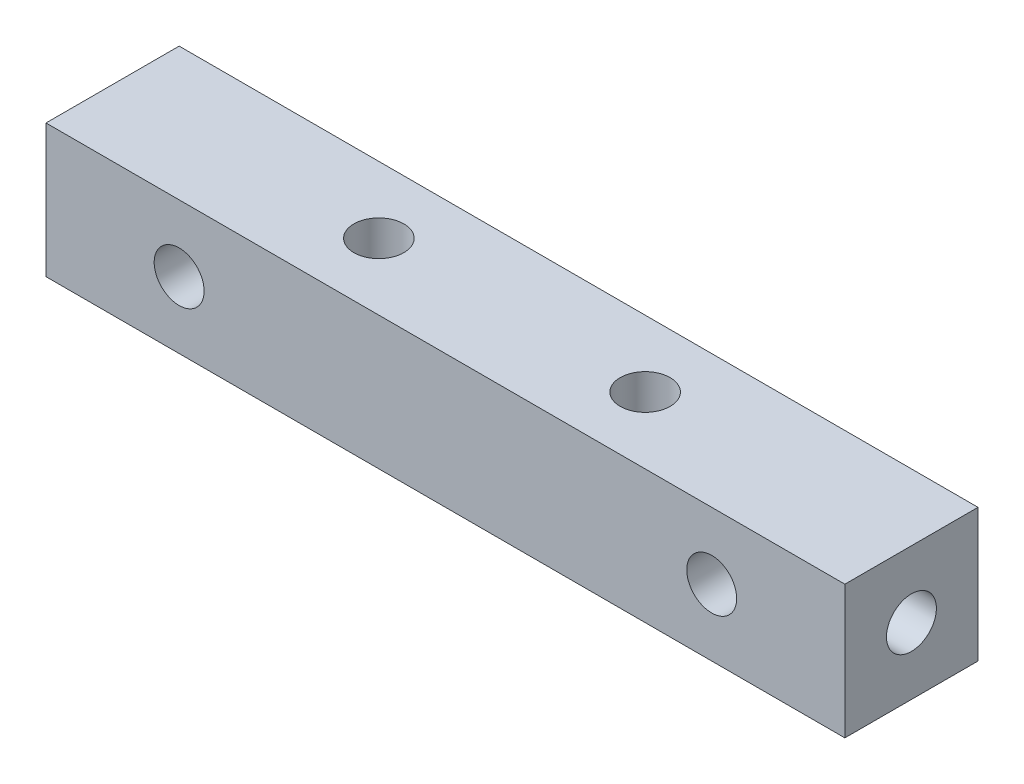
ISO-10303-21;
HEADER;
FILE_DESCRIPTION(('STEP AP214'),'2;1');
FILE_NAME('part.step','',(''),(''),'','','');
FILE_SCHEMA(('AUTOMOTIVE_DESIGN { 1 0 10303 214 1 1 1 1 }'));
ENDSEC;
DATA;
#1=APPLICATION_CONTEXT('core data for automotive mechanical design processes');
#2=APPLICATION_PROTOCOL_DEFINITION('international standard','automotive_design',2000,#1);
#3=PRODUCT_CONTEXT('',#1,'mechanical');
#4=PRODUCT('Part','Part','',(#3));
#5=PRODUCT_RELATED_PRODUCT_CATEGORY('part','',(#4));
#6=PRODUCT_DEFINITION_FORMATION('','',#4);
#7=PRODUCT_DEFINITION_CONTEXT('part definition',#1,'design');
#8=PRODUCT_DEFINITION('design','',#6,#7);
#9=PRODUCT_DEFINITION_SHAPE('','',#8);
#10=(LENGTH_UNIT() NAMED_UNIT(*) SI_UNIT(.MILLI.,.METRE.));
#11=(NAMED_UNIT(*) PLANE_ANGLE_UNIT() SI_UNIT($,.RADIAN.));
#12=(NAMED_UNIT(*) SI_UNIT($,.STERADIAN.) SOLID_ANGLE_UNIT());
#13=UNCERTAINTY_MEASURE_WITH_UNIT(LENGTH_MEASURE(1.E-05),#10,'distance_accuracy_value','');
#14=(GEOMETRIC_REPRESENTATION_CONTEXT(3) GLOBAL_UNCERTAINTY_ASSIGNED_CONTEXT((#13)) GLOBAL_UNIT_ASSIGNED_CONTEXT((#10,
#11,#12)) REPRESENTATION_CONTEXT('',''));
#15=CARTESIAN_POINT('',(0.,0.,0.));
#16=DIRECTION('',(0.,0.,1.));
#17=DIRECTION('',(1.,0.,0.));
#18=AXIS2_PLACEMENT_3D('',#15,#16,#17);
#19=CARTESIAN_POINT('',(16.,4.,-6.));
#20=DIRECTION('',(0.,0.,1.));
#21=DIRECTION('',(1.,0.,0.));
#22=AXIS2_PLACEMENT_3D('',#19,#20,#21);
#23=CYLINDRICAL_SURFACE('',#22,1.5);
#24=CARTESIAN_POINT('',(16.,4.,-4.));
#25=DIRECTION('',(0.,0.,1.));
#26=DIRECTION('',(1.,0.,0.));
#27=AXIS2_PLACEMENT_3D('',#24,#25,#26);
#28=CIRCLE('',#27,1.5);
#29=CARTESIAN_POINT('',(17.5,4.,-4.));
#30=VERTEX_POINT('',#29);
#31=EDGE_CURVE('E126',#30,#30,#28,.T.);
#32=ORIENTED_EDGE('',*,*,#31,.F.);
#33=EDGE_LOOP('',(#32));
#34=FACE_BOUND('',#33,.T.);
#35=CARTESIAN_POINT('',(16.,4.,4.));
#36=DIRECTION('',(0.,0.,1.));
#37=DIRECTION('',(1.,0.,0.));
#38=AXIS2_PLACEMENT_3D('',#35,#36,#37);
#39=CIRCLE('',#38,1.5);
#40=CARTESIAN_POINT('',(17.5,4.,4.));
#41=VERTEX_POINT('',#40);
#42=EDGE_CURVE('E175',#41,#41,#39,.T.);
#43=ORIENTED_EDGE('',*,*,#42,.T.);
#44=EDGE_LOOP('',(#43));
#45=FACE_BOUND('',#44,.T.);
#46=CARTESIAN_POINT('',(16.,4.,0.));
#47=DIRECTION('',(0.707106781186548,0.,0.707106781186547));
#48=DIRECTION('',(-0.707106781186547,0.,0.707106781186548));
#49=AXIS2_PLACEMENT_3D('',#46,#47,#48);
#50=ELLIPSE('',#49,2.12132034355964,1.5);
#51=CARTESIAN_POINT('',(16.,5.50000000000001,0.));
#52=VERTEX_POINT('',#51);
#53=CARTESIAN_POINT('',(16.,2.5,0.));
#54=VERTEX_POINT('',#53);
#55=EDGE_CURVE('E11',#52,#54,#50,.F.);
#56=ORIENTED_EDGE('',*,*,#55,.F.);
#57=CARTESIAN_POINT('',(16.,4.,0.));
#58=DIRECTION('',(-0.707106781186547,0.,0.707106781186548));
#59=DIRECTION('',(0.707106781186548,0.,0.707106781186547));
#60=AXIS2_PLACEMENT_3D('',#57,#58,#59);
#61=ELLIPSE('',#60,2.12132034355964,1.5);
#62=EDGE_CURVE('E50',#54,#52,#61,.T.);
#63=ORIENTED_EDGE('',*,*,#62,.F.);
#64=EDGE_LOOP('',(#56,#63));
#65=FACE_BOUND('',#64,.T.);
#66=ADVANCED_FACE('F39',(#34,#45,#65),#23,.F.);
#67=CARTESIAN_POINT('',(24.,8.,-4.));
#68=DIRECTION('',(-1.,0.,0.));
#69=DIRECTION('',(0.,0.,1.));
#70=AXIS2_PLACEMENT_3D('',#67,#68,#69);
#71=PLANE('',#70);
#72=CARTESIAN_POINT('',(24.,4.,0.));
#73=DIRECTION('',(-1.,0.,0.));
#74=DIRECTION('',(0.,0.,1.));
#75=AXIS2_PLACEMENT_3D('',#72,#73,#74);
#76=CIRCLE('',#75,1.5);
#77=CARTESIAN_POINT('',(24.,4.,1.5));
#78=VERTEX_POINT('',#77);
#79=EDGE_CURVE('E207',#78,#78,#76,.T.);
#80=ORIENTED_EDGE('',*,*,#79,.T.);
#81=EDGE_LOOP('',(#80));
#82=FACE_BOUND('',#81,.T.);
#83=DIRECTION('',(0.,0.,-1.));
#84=VECTOR('',#83,1.);
#85=CARTESIAN_POINT('',(24.,0.,-4.));
#86=LINE('',#85,#84);
#87=CARTESIAN_POINT('',(24.,0.,4.));
#88=VERTEX_POINT('',#87);
#89=CARTESIAN_POINT('',(24.,0.,-4.));
#90=VERTEX_POINT('',#89);
#91=EDGE_CURVE('E141',#88,#90,#86,.T.);
#92=ORIENTED_EDGE('',*,*,#91,.T.);
#93=DIRECTION('',(0.,-1.,0.));
#94=VECTOR('',#93,1.);
#95=CARTESIAN_POINT('',(24.,8.,-4.));
#96=LINE('',#95,#94);
#97=CARTESIAN_POINT('',(24.,8.,-4.));
#98=VERTEX_POINT('',#97);
#99=EDGE_CURVE('E137',#98,#90,#96,.T.);
#100=ORIENTED_EDGE('',*,*,#99,.F.);
#101=DIRECTION('',(0.,0.,-1.));
#102=VECTOR('',#101,1.);
#103=CARTESIAN_POINT('',(24.,8.,-4.));
#104=LINE('',#103,#102);
#105=CARTESIAN_POINT('',(24.,8.,4.));
#106=VERTEX_POINT('',#105);
#107=EDGE_CURVE('E153',#106,#98,#104,.T.);
#108=ORIENTED_EDGE('',*,*,#107,.F.);
#109=DIRECTION('',(0.,-1.,0.));
#110=VECTOR('',#109,1.);
#111=CARTESIAN_POINT('',(24.,8.,4.));
#112=LINE('',#111,#110);
#113=EDGE_CURVE('E159',#106,#88,#112,.T.);
#114=ORIENTED_EDGE('',*,*,#113,.T.);
#115=EDGE_LOOP('',(#92,#100,#108,#114));
#116=FACE_BOUND('',#115,.T.);
#117=ADVANCED_FACE('F41',(#82,#116),#71,.F.);
#118=CARTESIAN_POINT('',(-24.,8.,-4.));
#119=DIRECTION('',(0.,0.,1.));
#120=DIRECTION('',(1.,0.,0.));
#121=AXIS2_PLACEMENT_3D('',#118,#119,#120);
#122=PLANE('',#121);
#123=CARTESIAN_POINT('',(-16.,4.,-4.));
#124=DIRECTION('',(0.,0.,1.));
#125=DIRECTION('',(1.,0.,0.));
#126=AXIS2_PLACEMENT_3D('',#123,#124,#125);
#127=CIRCLE('',#126,1.5);
#128=CARTESIAN_POINT('',(-14.5,4.,-4.));
#129=VERTEX_POINT('',#128);
#130=EDGE_CURVE('E127',#129,#129,#127,.T.);
#131=ORIENTED_EDGE('',*,*,#130,.T.);
#132=EDGE_LOOP('',(#131));
#133=FACE_BOUND('',#132,.T.);
#134=ORIENTED_EDGE('',*,*,#31,.T.);
#135=EDGE_LOOP('',(#134));
#136=FACE_BOUND('',#135,.T.);
#137=DIRECTION('',(-1.,0.,0.));
#138=VECTOR('',#137,1.);
#139=CARTESIAN_POINT('',(-24.,0.,-4.));
#140=LINE('',#139,#138);
#141=CARTESIAN_POINT('',(-24.,0.,-4.));
#142=VERTEX_POINT('',#141);
#143=EDGE_CURVE('E135',#90,#142,#140,.T.);
#144=ORIENTED_EDGE('',*,*,#143,.T.);
#145=DIRECTION('',(0.,-1.,0.));
#146=VECTOR('',#145,1.);
#147=CARTESIAN_POINT('',(-24.,8.,-4.));
#148=LINE('',#147,#146);
#149=CARTESIAN_POINT('',(-24.,8.,-4.));
#150=VERTEX_POINT('',#149);
#151=EDGE_CURVE('E133',#150,#142,#148,.T.);
#152=ORIENTED_EDGE('',*,*,#151,.F.);
#153=DIRECTION('',(-1.,0.,0.));
#154=VECTOR('',#153,1.);
#155=CARTESIAN_POINT('',(-24.,8.,-4.));
#156=LINE('',#155,#154);
#157=EDGE_CURVE('E217',#98,#150,#156,.T.);
#158=ORIENTED_EDGE('',*,*,#157,.F.);
#159=ORIENTED_EDGE('',*,*,#99,.T.);
#160=EDGE_LOOP('',(#144,#152,#158,#159));
#161=FACE_BOUND('',#160,.T.);
#162=ADVANCED_FACE('F98',(#133,#136,#161),#122,.F.);
#163=CARTESIAN_POINT('',(-24.,8.,-4.));
#164=DIRECTION('',(1.,0.,0.));
#165=DIRECTION('',(0.,0.,-1.));
#166=AXIS2_PLACEMENT_3D('',#163,#164,#165);
#167=PLANE('',#166);
#168=CARTESIAN_POINT('',(-24.,4.,0.));
#169=DIRECTION('',(-1.,0.,0.));
#170=DIRECTION('',(0.,0.,1.));
#171=AXIS2_PLACEMENT_3D('',#168,#169,#170);
#172=CIRCLE('',#171,1.5);
#173=CARTESIAN_POINT('',(-24.,4.,1.5));
#174=VERTEX_POINT('',#173);
#175=EDGE_CURVE('E202',#174,#174,#172,.T.);
#176=ORIENTED_EDGE('',*,*,#175,.F.);
#177=EDGE_LOOP('',(#176));
#178=FACE_BOUND('',#177,.T.);
#179=DIRECTION('',(0.,0.,1.));
#180=VECTOR('',#179,1.);
#181=CARTESIAN_POINT('',(-24.,0.,-4.));
#182=LINE('',#181,#180);
#183=CARTESIAN_POINT('',(-24.,0.,4.));
#184=VERTEX_POINT('',#183);
#185=EDGE_CURVE('E145',#142,#184,#182,.T.);
#186=ORIENTED_EDGE('',*,*,#185,.T.);
#187=DIRECTION('',(0.,-1.,0.));
#188=VECTOR('',#187,1.);
#189=CARTESIAN_POINT('',(-24.,8.,4.));
#190=LINE('',#189,#188);
#191=CARTESIAN_POINT('',(-24.,8.,4.));
#192=VERTEX_POINT('',#191);
#193=EDGE_CURVE('E146',#192,#184,#190,.T.);
#194=ORIENTED_EDGE('',*,*,#193,.F.);
#195=DIRECTION('',(0.,0.,1.));
#196=VECTOR('',#195,1.);
#197=CARTESIAN_POINT('',(-24.,8.,-4.));
#198=LINE('',#197,#196);
#199=EDGE_CURVE('E149',#150,#192,#198,.T.);
#200=ORIENTED_EDGE('',*,*,#199,.F.);
#201=ORIENTED_EDGE('',*,*,#151,.T.);
#202=EDGE_LOOP('',(#186,#194,#200,#201));
#203=FACE_BOUND('',#202,.T.);
#204=ADVANCED_FACE('F114',(#178,#203),#167,.F.);
#205=CARTESIAN_POINT('',(-24.,8.,4.));
#206=DIRECTION('',(0.,0.,-1.));
#207=DIRECTION('',(-1.,0.,0.));
#208=AXIS2_PLACEMENT_3D('',#205,#206,#207);
#209=PLANE('',#208);
#210=CARTESIAN_POINT('',(-16.,4.,4.));
#211=DIRECTION('',(0.,0.,1.));
#212=DIRECTION('',(1.,0.,0.));
#213=AXIS2_PLACEMENT_3D('',#210,#211,#212);
#214=CIRCLE('',#213,1.5);
#215=CARTESIAN_POINT('',(-14.5,4.,4.));
#216=VERTEX_POINT('',#215);
#217=EDGE_CURVE('E209',#216,#216,#214,.T.);
#218=ORIENTED_EDGE('',*,*,#217,.F.);
#219=EDGE_LOOP('',(#218));
#220=FACE_BOUND('',#219,.T.);
#221=ORIENTED_EDGE('',*,*,#42,.F.);
#222=EDGE_LOOP('',(#221));
#223=FACE_BOUND('',#222,.T.);
#224=DIRECTION('',(1.,0.,0.));
#225=VECTOR('',#224,1.);
#226=CARTESIAN_POINT('',(-24.,0.,4.));
#227=LINE('',#226,#225);
#228=EDGE_CURVE('E155',#184,#88,#227,.T.);
#229=ORIENTED_EDGE('',*,*,#228,.T.);
#230=ORIENTED_EDGE('',*,*,#113,.F.);
#231=DIRECTION('',(1.,0.,0.));
#232=VECTOR('',#231,1.);
#233=CARTESIAN_POINT('',(-24.,8.,4.));
#234=LINE('',#233,#232);
#235=EDGE_CURVE('E163',#192,#106,#234,.T.);
#236=ORIENTED_EDGE('',*,*,#235,.F.);
#237=ORIENTED_EDGE('',*,*,#193,.T.);
#238=EDGE_LOOP('',(#229,#230,#236,#237));
#239=FACE_BOUND('',#238,.T.);
#240=ADVANCED_FACE('F108',(#220,#223,#239),#209,.F.);
#241=CARTESIAN_POINT('',(0.,8.,0.));
#242=DIRECTION('',(0.,1.,0.));
#243=DIRECTION('',(0.,0.,1.));
#244=AXIS2_PLACEMENT_3D('',#241,#242,#243);
#245=PLANE('',#244);
#246=CARTESIAN_POINT('',(-8.,8.,0.));
#247=DIRECTION('',(0.,1.,0.));
#248=DIRECTION('',(0.,0.,1.));
#249=AXIS2_PLACEMENT_3D('',#246,#247,#248);
#250=CIRCLE('',#249,1.5);
#251=CARTESIAN_POINT('',(-8.,8.,1.5));
#252=VERTEX_POINT('',#251);
#253=EDGE_CURVE('E169',#252,#252,#250,.T.);
#254=ORIENTED_EDGE('',*,*,#253,.F.);
#255=EDGE_LOOP('',(#254));
#256=FACE_BOUND('',#255,.T.);
#257=CARTESIAN_POINT('',(8.,8.,0.));
#258=DIRECTION('',(0.,1.,0.));
#259=DIRECTION('',(0.,0.,1.));
#260=AXIS2_PLACEMENT_3D('',#257,#258,#259);
#261=CIRCLE('',#260,1.5);
#262=CARTESIAN_POINT('',(8.,8.,1.5));
#263=VERTEX_POINT('',#262);
#264=EDGE_CURVE('E197',#263,#263,#261,.T.);
#265=ORIENTED_EDGE('',*,*,#264,.F.);
#266=EDGE_LOOP('',(#265));
#267=FACE_BOUND('',#266,.T.);
#268=ORIENTED_EDGE('',*,*,#107,.T.);
#269=ORIENTED_EDGE('',*,*,#157,.T.);
#270=ORIENTED_EDGE('',*,*,#199,.T.);
#271=ORIENTED_EDGE('',*,*,#235,.T.);
#272=EDGE_LOOP('',(#268,#269,#270,#271));
#273=FACE_BOUND('',#272,.T.);
#274=ADVANCED_FACE('F104',(#256,#267,#273),#245,.T.);
#275=CARTESIAN_POINT('',(0.,0.,0.));
#276=DIRECTION('',(0.,1.,0.));
#277=DIRECTION('',(0.,0.,1.));
#278=AXIS2_PLACEMENT_3D('',#275,#276,#277);
#279=PLANE('',#278);
#280=CARTESIAN_POINT('',(-8.,0.,0.));
#281=DIRECTION('',(0.,1.,0.));
#282=DIRECTION('',(0.,0.,1.));
#283=AXIS2_PLACEMENT_3D('',#280,#281,#282);
#284=CIRCLE('',#283,1.5);
#285=CARTESIAN_POINT('',(-8.,0.,1.5));
#286=VERTEX_POINT('',#285);
#287=EDGE_CURVE('E166',#286,#286,#284,.T.);
#288=ORIENTED_EDGE('',*,*,#287,.T.);
#289=EDGE_LOOP('',(#288));
#290=FACE_BOUND('',#289,.T.);
#291=CARTESIAN_POINT('',(8.,0.,0.));
#292=DIRECTION('',(0.,1.,0.));
#293=DIRECTION('',(0.,0.,1.));
#294=AXIS2_PLACEMENT_3D('',#291,#292,#293);
#295=CIRCLE('',#294,1.5);
#296=CARTESIAN_POINT('',(8.,0.,1.5));
#297=VERTEX_POINT('',#296);
#298=EDGE_CURVE('E164',#297,#297,#295,.T.);
#299=ORIENTED_EDGE('',*,*,#298,.T.);
#300=EDGE_LOOP('',(#299));
#301=FACE_BOUND('',#300,.T.);
#302=ORIENTED_EDGE('',*,*,#91,.F.);
#303=ORIENTED_EDGE('',*,*,#228,.F.);
#304=ORIENTED_EDGE('',*,*,#185,.F.);
#305=ORIENTED_EDGE('',*,*,#143,.F.);
#306=EDGE_LOOP('',(#302,#303,#304,#305));
#307=FACE_BOUND('',#306,.T.);
#308=ADVANCED_FACE('F110',(#290,#301,#307),#279,.F.);
#309=CARTESIAN_POINT('',(-16.,4.,-6.));
#310=DIRECTION('',(0.,0.,1.));
#311=DIRECTION('',(1.,0.,0.));
#312=AXIS2_PLACEMENT_3D('',#309,#310,#311);
#313=CYLINDRICAL_SURFACE('',#312,1.5);
#314=CARTESIAN_POINT('',(-16.,4.,0.));
#315=DIRECTION('',(0.707106781186547,0.,0.707106781186548));
#316=DIRECTION('',(-0.707106781186548,0.,0.707106781186547));
#317=AXIS2_PLACEMENT_3D('',#314,#315,#316);
#318=ELLIPSE('',#317,2.12132034355964,1.5);
#319=CARTESIAN_POINT('',(-16.,2.5,0.));
#320=VERTEX_POINT('',#319);
#321=CARTESIAN_POINT('',(-16.,5.5,0.));
#322=VERTEX_POINT('',#321);
#323=EDGE_CURVE('E165',#320,#322,#318,.F.);
#324=ORIENTED_EDGE('',*,*,#323,.T.);
#325=CARTESIAN_POINT('',(-16.,4.,0.));
#326=DIRECTION('',(-0.707106781186548,0.,0.707106781186547));
#327=DIRECTION('',(0.707106781186547,0.,0.707106781186548));
#328=AXIS2_PLACEMENT_3D('',#325,#326,#327);
#329=ELLIPSE('',#328,2.12132034355964,1.5);
#330=EDGE_CURVE('E59',#322,#320,#329,.T.);
#331=ORIENTED_EDGE('',*,*,#330,.T.);
#332=EDGE_LOOP('',(#324,#331));
#333=FACE_BOUND('',#332,.T.);
#334=ORIENTED_EDGE('',*,*,#217,.T.);
#335=EDGE_LOOP('',(#334));
#336=FACE_BOUND('',#335,.T.);
#337=ORIENTED_EDGE('',*,*,#130,.F.);
#338=EDGE_LOOP('',(#337));
#339=FACE_BOUND('',#338,.T.);
#340=ADVANCED_FACE('F105',(#333,#336,#339),#313,.F.);
#341=CARTESIAN_POINT('',(8.,-2.,0.));
#342=DIRECTION('',(0.,1.,0.));
#343=DIRECTION('',(0.,0.,1.));
#344=AXIS2_PLACEMENT_3D('',#341,#342,#343);
#345=CYLINDRICAL_SURFACE('',#344,1.5);
#346=ORIENTED_EDGE('',*,*,#264,.T.);
#347=EDGE_LOOP('',(#346));
#348=FACE_BOUND('',#347,.T.);
#349=ORIENTED_EDGE('',*,*,#298,.F.);
#350=EDGE_LOOP('',(#349));
#351=FACE_BOUND('',#350,.T.);
#352=ADVANCED_FACE('F190',(#348,#351),#345,.F.);
#353=CARTESIAN_POINT('',(-8.,-2.,0.));
#354=DIRECTION('',(0.,1.,0.));
#355=DIRECTION('',(0.,0.,1.));
#356=AXIS2_PLACEMENT_3D('',#353,#354,#355);
#357=CYLINDRICAL_SURFACE('',#356,1.5);
#358=ORIENTED_EDGE('',*,*,#253,.T.);
#359=EDGE_LOOP('',(#358));
#360=FACE_BOUND('',#359,.T.);
#361=ORIENTED_EDGE('',*,*,#287,.F.);
#362=EDGE_LOOP('',(#361));
#363=FACE_BOUND('',#362,.T.);
#364=ADVANCED_FACE('F180',(#360,#363),#357,.F.);
#365=CARTESIAN_POINT('',(-16.,4.,0.));
#366=DIRECTION('',(-1.,0.,0.));
#367=DIRECTION('',(0.,0.,1.));
#368=AXIS2_PLACEMENT_3D('',#365,#366,#367);
#369=CYLINDRICAL_SURFACE('',#368,1.5);
#370=ORIENTED_EDGE('',*,*,#175,.T.);
#371=EDGE_LOOP('',(#370));
#372=FACE_BOUND('',#371,.T.);
#373=ORIENTED_EDGE('',*,*,#323,.F.);
#374=ORIENTED_EDGE('',*,*,#330,.F.);
#375=EDGE_LOOP('',(#373,#374));
#376=FACE_BOUND('',#375,.T.);
#377=ADVANCED_FACE('F176',(#372,#376),#369,.F.);
#378=CARTESIAN_POINT('',(16.,4.,0.));
#379=DIRECTION('',(1.,0.,0.));
#380=DIRECTION('',(0.,0.,-1.));
#381=AXIS2_PLACEMENT_3D('',#378,#379,#380);
#382=CYLINDRICAL_SURFACE('',#381,1.5);
#383=ORIENTED_EDGE('',*,*,#79,.F.);
#384=EDGE_LOOP('',(#383));
#385=FACE_BOUND('',#384,.T.);
#386=ORIENTED_EDGE('',*,*,#55,.T.);
#387=ORIENTED_EDGE('',*,*,#62,.T.);
#388=EDGE_LOOP('',(#386,#387));
#389=FACE_BOUND('',#388,.T.);
#390=ADVANCED_FACE('F90',(#385,#389),#382,.F.);
#391=CLOSED_SHELL('',(#66,#117,#162,#204,#240,#274,#308,#340,#352,#364,#377,#390));
#392=MANIFOLD_SOLID_BREP('B2',#391);
#393=ADVANCED_BREP_SHAPE_REPRESENTATION('',(#18,#392),#14);
#394=SHAPE_DEFINITION_REPRESENTATION(#9,#393);
ENDSEC;
END-ISO-10303-21;
